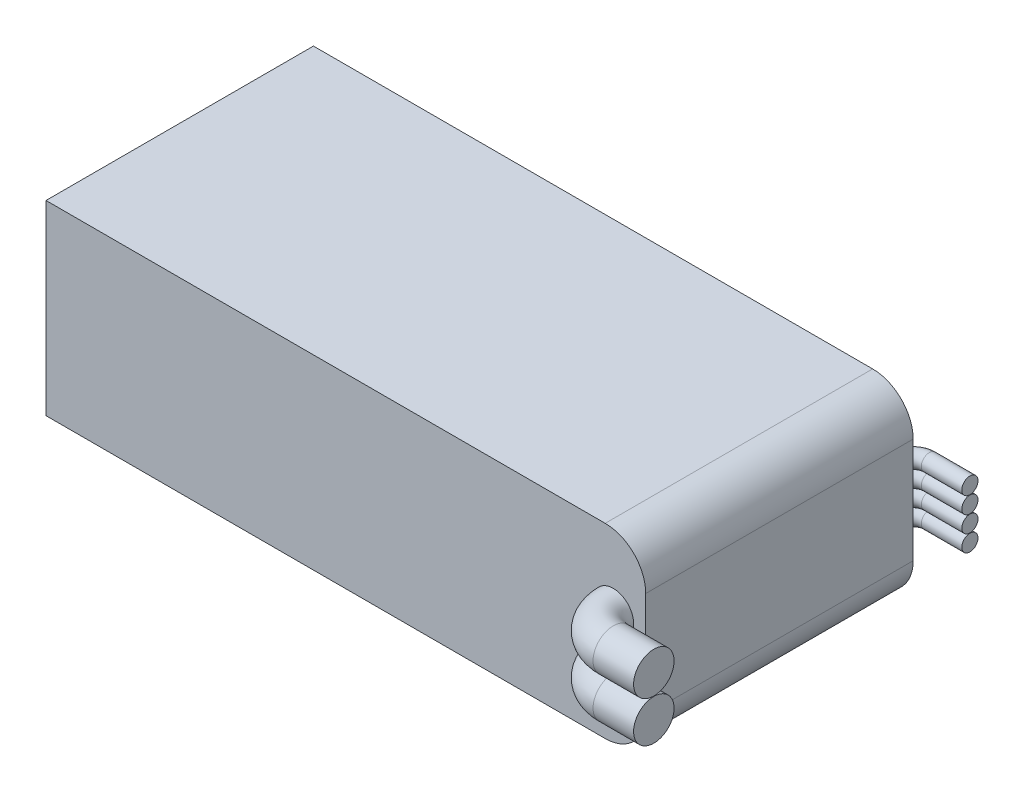
ISO-10303-21;
HEADER;
FILE_DESCRIPTION(('STEP AP214'),'2;1');
FILE_NAME('part.step','',(''),(''),'','','');
FILE_SCHEMA(('AUTOMOTIVE_DESIGN { 1 0 10303 214 1 1 1 1 }'));
ENDSEC;
DATA;
#1=APPLICATION_CONTEXT('core data for automotive mechanical design processes');
#2=APPLICATION_PROTOCOL_DEFINITION('international standard','automotive_design',2000,#1);
#3=PRODUCT_CONTEXT('',#1,'mechanical');
#4=PRODUCT('Part','Part','',(#3));
#5=PRODUCT_RELATED_PRODUCT_CATEGORY('part','',(#4));
#6=PRODUCT_DEFINITION_FORMATION('','',#4);
#7=PRODUCT_DEFINITION_CONTEXT('part definition',#1,'design');
#8=PRODUCT_DEFINITION('design','',#6,#7);
#9=PRODUCT_DEFINITION_SHAPE('','',#8);
#10=(LENGTH_UNIT() NAMED_UNIT(*) SI_UNIT(.MILLI.,.METRE.));
#11=(NAMED_UNIT(*) PLANE_ANGLE_UNIT() SI_UNIT($,.RADIAN.));
#12=(NAMED_UNIT(*) SI_UNIT($,.STERADIAN.) SOLID_ANGLE_UNIT());
#13=UNCERTAINTY_MEASURE_WITH_UNIT(LENGTH_MEASURE(1.E-05),#10,'distance_accuracy_value','');
#14=(GEOMETRIC_REPRESENTATION_CONTEXT(3) GLOBAL_UNCERTAINTY_ASSIGNED_CONTEXT((#13)) GLOBAL_UNIT_ASSIGNED_CONTEXT((#10,
#11,#12)) REPRESENTATION_CONTEXT('',''));
#15=CARTESIAN_POINT('',(0.,0.,0.));
#16=DIRECTION('',(0.,0.,1.));
#17=DIRECTION('',(1.,0.,0.));
#18=AXIS2_PLACEMENT_3D('',#15,#16,#17);
#19=CARTESIAN_POINT('',(37.,23.,16.5));
#20=DIRECTION('',(-1.,0.,0.));
#21=DIRECTION('',(0.,0.,1.));
#22=AXIS2_PLACEMENT_3D('',#19,#20,#21);
#23=PLANE('',#22);
#24=DIRECTION('',(0.,-1.,0.));
#25=VECTOR('',#24,1.);
#26=CARTESIAN_POINT('',(37.,23.,16.5));
#27=LINE('',#26,#25);
#28=CARTESIAN_POINT('',(37.,18.,16.5));
#29=VERTEX_POINT('',#28);
#30=CARTESIAN_POINT('',(37.,5.,16.5));
#31=VERTEX_POINT('',#30);
#32=EDGE_CURVE('E129',#29,#31,#27,.T.);
#33=ORIENTED_EDGE('',*,*,#32,.T.);
#34=DIRECTION('',(0.,0.,-1.));
#35=VECTOR('',#34,1.);
#36=CARTESIAN_POINT('',(37.,5.,-16.5));
#37=LINE('',#36,#35);
#38=CARTESIAN_POINT('',(37.,5.,-16.5));
#39=VERTEX_POINT('',#38);
#40=EDGE_CURVE('E151',#31,#39,#37,.T.);
#41=ORIENTED_EDGE('',*,*,#40,.T.);
#42=DIRECTION('',(0.,-1.,0.));
#43=VECTOR('',#42,1.);
#44=CARTESIAN_POINT('',(37.,23.,-16.5));
#45=LINE('',#44,#43);
#46=CARTESIAN_POINT('',(37.,18.,-16.5));
#47=VERTEX_POINT('',#46);
#48=EDGE_CURVE('E120',#47,#39,#45,.T.);
#49=ORIENTED_EDGE('',*,*,#48,.F.);
#50=DIRECTION('',(0.,0.,-1.));
#51=VECTOR('',#50,1.);
#52=CARTESIAN_POINT('',(37.,18.,16.5));
#53=LINE('',#52,#51);
#54=EDGE_CURVE('E148',#47,#29,#53,.F.);
#55=ORIENTED_EDGE('',*,*,#54,.T.);
#56=EDGE_LOOP('',(#33,#41,#49,#55));
#57=FACE_BOUND('',#56,.T.);
#58=ADVANCED_FACE('F41',(#57),#23,.F.);
#59=CARTESIAN_POINT('',(-37.,23.,-16.5));
#60=DIRECTION('',(0.,0.,1.));
#61=DIRECTION('',(1.,0.,0.));
#62=AXIS2_PLACEMENT_3D('',#59,#60,#61);
#63=PLANE('',#62);
#64=CARTESIAN_POINT('',(35.,8.44,-16.5));
#65=DIRECTION('',(0.,0.,-1.));
#66=DIRECTION('',(-1.,0.,0.));
#67=AXIS2_PLACEMENT_3D('',#64,#65,#66);
#68=CIRCLE('',#67,0.999999999999998);
#69=CARTESIAN_POINT('',(34.,8.44,-16.5));
#70=VERTEX_POINT('',#69);
#71=EDGE_CURVE('E284',#70,#70,#68,.T.);
#72=ORIENTED_EDGE('',*,*,#71,.F.);
#73=EDGE_LOOP('',(#72));
#74=FACE_BOUND('',#73,.T.);
#75=CARTESIAN_POINT('',(35.,14.56,-16.5));
#76=DIRECTION('',(0.,0.,-1.));
#77=DIRECTION('',(-1.,0.,0.));
#78=AXIS2_PLACEMENT_3D('',#75,#76,#77);
#79=CIRCLE('',#78,0.999999999999998);
#80=CARTESIAN_POINT('',(34.,14.56,-16.5));
#81=VERTEX_POINT('',#80);
#82=EDGE_CURVE('E272',#81,#81,#79,.T.);
#83=ORIENTED_EDGE('',*,*,#82,.F.);
#84=EDGE_LOOP('',(#83));
#85=FACE_BOUND('',#84,.T.);
#86=CARTESIAN_POINT('',(35.,10.48,-16.5));
#87=DIRECTION('',(0.,0.,-1.));
#88=DIRECTION('',(-1.,0.,0.));
#89=AXIS2_PLACEMENT_3D('',#86,#87,#88);
#90=CIRCLE('',#89,0.999999999999998);
#91=CARTESIAN_POINT('',(34.,10.48,-16.5));
#92=VERTEX_POINT('',#91);
#93=EDGE_CURVE('E260',#92,#92,#90,.T.);
#94=ORIENTED_EDGE('',*,*,#93,.F.);
#95=EDGE_LOOP('',(#94));
#96=FACE_BOUND('',#95,.T.);
#97=CARTESIAN_POINT('',(35.,12.52,-16.5));
#98=DIRECTION('',(0.,0.,-1.));
#99=DIRECTION('',(-1.,0.,0.));
#100=AXIS2_PLACEMENT_3D('',#97,#98,#99);
#101=CIRCLE('',#100,0.999999999999998);
#102=CARTESIAN_POINT('',(34.,12.52,-16.5));
#103=VERTEX_POINT('',#102);
#104=EDGE_CURVE('E11',#103,#103,#101,.T.);
#105=ORIENTED_EDGE('',*,*,#104,.F.);
#106=EDGE_LOOP('',(#105));
#107=FACE_BOUND('',#106,.T.);
#108=ORIENTED_EDGE('',*,*,#48,.T.);
#109=CARTESIAN_POINT('',(32.,5.,-16.5));
#110=DIRECTION('',(0.,0.,1.));
#111=DIRECTION('',(1.,0.,0.));
#112=AXIS2_PLACEMENT_3D('',#109,#110,#111);
#113=CIRCLE('',#112,5.);
#114=CARTESIAN_POINT('',(32.,0.,-16.5));
#115=VERTEX_POINT('',#114);
#116=EDGE_CURVE('E158',#39,#115,#113,.F.);
#117=ORIENTED_EDGE('',*,*,#116,.T.);
#118=DIRECTION('',(-1.,0.,0.));
#119=VECTOR('',#118,1.);
#120=CARTESIAN_POINT('',(-37.,0.,-16.5));
#121=LINE('',#120,#119);
#122=CARTESIAN_POINT('',(-37.,0.,-16.5));
#123=VERTEX_POINT('',#122);
#124=EDGE_CURVE('E116',#115,#123,#121,.T.);
#125=ORIENTED_EDGE('',*,*,#124,.T.);
#126=DIRECTION('',(0.,-1.,0.));
#127=VECTOR('',#126,1.);
#128=CARTESIAN_POINT('',(-37.,23.,-16.5));
#129=LINE('',#128,#127);
#130=CARTESIAN_POINT('',(-37.,23.,-16.5));
#131=VERTEX_POINT('',#130);
#132=EDGE_CURVE('E113',#131,#123,#129,.T.);
#133=ORIENTED_EDGE('',*,*,#132,.F.);
#134=DIRECTION('',(-1.,0.,0.));
#135=VECTOR('',#134,1.);
#136=CARTESIAN_POINT('',(-37.,23.,-16.5));
#137=LINE('',#136,#135);
#138=CARTESIAN_POINT('',(32.,23.,-16.5));
#139=VERTEX_POINT('',#138);
#140=EDGE_CURVE('E101',#139,#131,#137,.T.);
#141=ORIENTED_EDGE('',*,*,#140,.F.);
#142=CARTESIAN_POINT('',(32.,18.,-16.5));
#143=DIRECTION('',(0.,0.,1.));
#144=DIRECTION('',(1.,0.,0.));
#145=AXIS2_PLACEMENT_3D('',#142,#143,#144);
#146=CIRCLE('',#145,5.);
#147=EDGE_CURVE('E155',#139,#47,#146,.F.);
#148=ORIENTED_EDGE('',*,*,#147,.T.);
#149=EDGE_LOOP('',(#108,#117,#125,#133,#141,#148));
#150=FACE_BOUND('',#149,.T.);
#151=ADVANCED_FACE('F115',(#74,#85,#96,#107,#150),#63,.F.);
#152=CARTESIAN_POINT('',(-37.,23.,16.5));
#153=DIRECTION('',(1.,0.,0.));
#154=DIRECTION('',(0.,0.,-1.));
#155=AXIS2_PLACEMENT_3D('',#152,#153,#154);
#156=PLANE('',#155);
#157=DIRECTION('',(0.,0.,1.));
#158=VECTOR('',#157,1.);
#159=CARTESIAN_POINT('',(-37.,0.,16.5));
#160=LINE('',#159,#158);
#161=CARTESIAN_POINT('',(-37.,0.,16.5));
#162=VERTEX_POINT('',#161);
#163=EDGE_CURVE('E135',#123,#162,#160,.T.);
#164=ORIENTED_EDGE('',*,*,#163,.T.);
#165=DIRECTION('',(0.,-1.,0.));
#166=VECTOR('',#165,1.);
#167=CARTESIAN_POINT('',(-37.,23.,16.5));
#168=LINE('',#167,#166);
#169=CARTESIAN_POINT('',(-37.,23.,16.5));
#170=VERTEX_POINT('',#169);
#171=EDGE_CURVE('E121',#170,#162,#168,.T.);
#172=ORIENTED_EDGE('',*,*,#171,.F.);
#173=DIRECTION('',(0.,0.,1.));
#174=VECTOR('',#173,1.);
#175=CARTESIAN_POINT('',(-37.,23.,16.5));
#176=LINE('',#175,#174);
#177=EDGE_CURVE('E105',#131,#170,#176,.T.);
#178=ORIENTED_EDGE('',*,*,#177,.F.);
#179=ORIENTED_EDGE('',*,*,#132,.T.);
#180=EDGE_LOOP('',(#164,#172,#178,#179));
#181=FACE_BOUND('',#180,.T.);
#182=ADVANCED_FACE('F123',(#181),#156,.F.);
#183=CARTESIAN_POINT('',(-37.,23.,16.5));
#184=DIRECTION('',(0.,0.,-1.));
#185=DIRECTION('',(-1.,0.,0.));
#186=AXIS2_PLACEMENT_3D('',#183,#184,#185);
#187=PLANE('',#186);
#188=CARTESIAN_POINT('',(33.,9.,16.5));
#189=DIRECTION('',(0.,0.,1.));
#190=DIRECTION('',(1.,0.,0.));
#191=AXIS2_PLACEMENT_3D('',#188,#189,#190);
#192=CIRCLE('',#191,2.5);
#193=CARTESIAN_POINT('',(30.5,9.,16.5));
#194=VERTEX_POINT('',#193);
#195=EDGE_CURVE('E236',#194,#194,#192,.T.);
#196=ORIENTED_EDGE('',*,*,#195,.F.);
#197=EDGE_LOOP('',(#196));
#198=FACE_BOUND('',#197,.T.);
#199=CARTESIAN_POINT('',(33.,14.05,16.5));
#200=DIRECTION('',(0.,0.,1.));
#201=DIRECTION('',(1.,0.,0.));
#202=AXIS2_PLACEMENT_3D('',#199,#200,#201);
#203=CIRCLE('',#202,2.5);
#204=CARTESIAN_POINT('',(30.5,14.05,16.5));
#205=VERTEX_POINT('',#204);
#206=EDGE_CURVE('E51',#205,#205,#203,.T.);
#207=ORIENTED_EDGE('',*,*,#206,.F.);
#208=EDGE_LOOP('',(#207));
#209=FACE_BOUND('',#208,.T.);
#210=DIRECTION('',(1.,0.,0.));
#211=VECTOR('',#210,1.);
#212=CARTESIAN_POINT('',(-37.,0.,16.5));
#213=LINE('',#212,#211);
#214=CARTESIAN_POINT('',(32.,0.,16.5));
#215=VERTEX_POINT('',#214);
#216=EDGE_CURVE('E110',#162,#215,#213,.T.);
#217=ORIENTED_EDGE('',*,*,#216,.T.);
#218=CARTESIAN_POINT('',(32.,5.,16.5));
#219=DIRECTION('',(0.,0.,-1.));
#220=DIRECTION('',(-1.,0.,0.));
#221=AXIS2_PLACEMENT_3D('',#218,#219,#220);
#222=CIRCLE('',#221,5.);
#223=EDGE_CURVE('E164',#215,#31,#222,.F.);
#224=ORIENTED_EDGE('',*,*,#223,.T.);
#225=ORIENTED_EDGE('',*,*,#32,.F.);
#226=CARTESIAN_POINT('',(32.,18.,16.5));
#227=DIRECTION('',(0.,0.,-1.));
#228=DIRECTION('',(-1.,0.,0.));
#229=AXIS2_PLACEMENT_3D('',#226,#227,#228);
#230=CIRCLE('',#229,5.);
#231=CARTESIAN_POINT('',(32.,23.,16.5));
#232=VERTEX_POINT('',#231);
#233=EDGE_CURVE('E59',#29,#232,#230,.F.);
#234=ORIENTED_EDGE('',*,*,#233,.T.);
#235=DIRECTION('',(1.,0.,0.));
#236=VECTOR('',#235,1.);
#237=CARTESIAN_POINT('',(-37.,23.,16.5));
#238=LINE('',#237,#236);
#239=EDGE_CURVE('E126',#170,#232,#238,.T.);
#240=ORIENTED_EDGE('',*,*,#239,.F.);
#241=ORIENTED_EDGE('',*,*,#171,.T.);
#242=EDGE_LOOP('',(#217,#224,#225,#234,#240,#241));
#243=FACE_BOUND('',#242,.T.);
#244=ADVANCED_FACE('F224',(#198,#209,#243),#187,.F.);
#245=CARTESIAN_POINT('',(0.,23.,0.));
#246=DIRECTION('',(0.,-1.,0.));
#247=DIRECTION('',(0.,0.,-1.));
#248=AXIS2_PLACEMENT_3D('',#245,#246,#247);
#249=PLANE('',#248);
#250=ORIENTED_EDGE('',*,*,#239,.T.);
#251=DIRECTION('',(0.,0.,-1.));
#252=VECTOR('',#251,1.);
#253=CARTESIAN_POINT('',(32.,23.,0.));
#254=LINE('',#253,#252);
#255=EDGE_CURVE('E45',#232,#139,#254,.T.);
#256=ORIENTED_EDGE('',*,*,#255,.T.);
#257=ORIENTED_EDGE('',*,*,#140,.T.);
#258=ORIENTED_EDGE('',*,*,#177,.T.);
#259=EDGE_LOOP('',(#250,#256,#257,#258));
#260=FACE_BOUND('',#259,.T.);
#261=ADVANCED_FACE('F103',(#260),#249,.F.);
#262=CARTESIAN_POINT('',(0.,0.,0.));
#263=DIRECTION('',(0.,-1.,0.));
#264=DIRECTION('',(0.,0.,-1.));
#265=AXIS2_PLACEMENT_3D('',#262,#263,#264);
#266=PLANE('',#265);
#267=ORIENTED_EDGE('',*,*,#124,.F.);
#268=DIRECTION('',(0.,0.,-1.));
#269=VECTOR('',#268,1.);
#270=CARTESIAN_POINT('',(32.,0.,16.5));
#271=LINE('',#270,#269);
#272=EDGE_CURVE('E67',#115,#215,#271,.F.);
#273=ORIENTED_EDGE('',*,*,#272,.T.);
#274=ORIENTED_EDGE('',*,*,#216,.F.);
#275=ORIENTED_EDGE('',*,*,#163,.F.);
#276=EDGE_LOOP('',(#267,#273,#274,#275));
#277=FACE_BOUND('',#276,.T.);
#278=ADVANCED_FACE('F213',(#277),#266,.T.);
#279=CARTESIAN_POINT('',(32.,5.,16.5));
#280=DIRECTION('',(0.,0.,1.));
#281=DIRECTION('',(1.,0.,0.));
#282=AXIS2_PLACEMENT_3D('',#279,#280,#281);
#283=CYLINDRICAL_SURFACE('',#282,5.);
#284=ORIENTED_EDGE('',*,*,#223,.F.);
#285=ORIENTED_EDGE('',*,*,#272,.F.);
#286=ORIENTED_EDGE('',*,*,#116,.F.);
#287=ORIENTED_EDGE('',*,*,#40,.F.);
#288=EDGE_LOOP('',(#284,#285,#286,#287));
#289=FACE_BOUND('',#288,.T.);
#290=ADVANCED_FACE('F211',(#289),#283,.T.);
#291=CARTESIAN_POINT('',(32.,18.,0.));
#292=DIRECTION('',(0.,0.,-1.));
#293=DIRECTION('',(-1.,0.,0.));
#294=AXIS2_PLACEMENT_3D('',#291,#292,#293);
#295=CYLINDRICAL_SURFACE('',#294,5.);
#296=ORIENTED_EDGE('',*,*,#233,.F.);
#297=ORIENTED_EDGE('',*,*,#54,.F.);
#298=ORIENTED_EDGE('',*,*,#147,.F.);
#299=ORIENTED_EDGE('',*,*,#255,.F.);
#300=EDGE_LOOP('',(#296,#297,#298,#299));
#301=FACE_BOUND('',#300,.T.);
#302=ADVANCED_FACE('F43',(#301),#295,.T.);
#303=CARTESIAN_POINT('',(42.,14.05,20.5));
#304=DIRECTION('',(1.,0.,0.));
#305=DIRECTION('',(0.,0.,-1.));
#306=AXIS2_PLACEMENT_3D('',#303,#304,#305);
#307=PLANE('',#306);
#308=CARTESIAN_POINT('',(42.,14.05,20.5));
#309=DIRECTION('',(1.,0.,0.));
#310=DIRECTION('',(0.,0.,-1.));
#311=AXIS2_PLACEMENT_3D('',#308,#309,#310);
#312=CIRCLE('',#311,2.5);
#313=CARTESIAN_POINT('',(42.,14.05,18.));
#314=VERTEX_POINT('',#313);
#315=EDGE_CURVE('E136',#314,#314,#312,.T.);
#316=ORIENTED_EDGE('',*,*,#315,.T.);
#317=EDGE_LOOP('',(#316));
#318=FACE_BOUND('',#317,.T.);
#319=ADVANCED_FACE('F184',(#318),#307,.T.);
#320=CARTESIAN_POINT('',(37.,14.05,16.5));
#321=DIRECTION('',(0.,1.,0.));
#322=DIRECTION('',(0.,0.,1.));
#323=AXIS2_PLACEMENT_3D('',#320,#321,#322);
#324=TOROIDAL_SURFACE('',#323,3.99999999999999,2.5);
#325=CARTESIAN_POINT('',(37.,14.05,20.5));
#326=DIRECTION('',(1.,0.,0.));
#327=DIRECTION('',(0.,0.,-1.));
#328=AXIS2_PLACEMENT_3D('',#325,#326,#327);
#329=CIRCLE('',#328,2.5);
#330=CARTESIAN_POINT('',(37.,14.05,23.));
#331=VERTEX_POINT('',#330);
#332=EDGE_CURVE('E177',#331,#331,#329,.T.);
#333=CARTESIAN_POINT('',(37.,14.05,16.5));
#334=DIRECTION('',(0.,1.,0.));
#335=DIRECTION('',(0.,0.,1.));
#336=AXIS2_PLACEMENT_3D('',#333,#334,#335);
#337=CIRCLE('',#336,6.49999999999999);
#338=EDGE_CURVE('',#205,#331,#337,.T.);
#339=ORIENTED_EDGE('',*,*,#206,.T.);
#340=ORIENTED_EDGE('',*,*,#332,.F.);
#341=ORIENTED_EDGE('',*,*,#338,.T.);
#342=ORIENTED_EDGE('',*,*,#338,.F.);
#343=EDGE_LOOP('',(#339,#341,#340,#342));
#344=FACE_BOUND('',#343,.T.);
#345=ADVANCED_FACE('F190',(#344),#324,.T.);
#346=CARTESIAN_POINT('',(37.,14.05,20.5));
#347=DIRECTION('',(1.,0.,0.));
#348=DIRECTION('',(0.,0.,-1.));
#349=AXIS2_PLACEMENT_3D('',#346,#347,#348);
#350=CYLINDRICAL_SURFACE('',#349,2.5);
#351=ORIENTED_EDGE('',*,*,#315,.F.);
#352=EDGE_LOOP('',(#351));
#353=FACE_BOUND('',#352,.T.);
#354=ORIENTED_EDGE('',*,*,#332,.T.);
#355=EDGE_LOOP('',(#354));
#356=FACE_BOUND('',#355,.T.);
#357=ADVANCED_FACE('F186',(#353,#356),#350,.T.);
#358=CARTESIAN_POINT('',(42.,9.,20.5));
#359=DIRECTION('',(1.,0.,0.));
#360=DIRECTION('',(0.,0.,-1.));
#361=AXIS2_PLACEMENT_3D('',#358,#359,#360);
#362=PLANE('',#361);
#363=CARTESIAN_POINT('',(42.,9.,20.5));
#364=DIRECTION('',(1.,0.,0.));
#365=DIRECTION('',(0.,0.,-1.));
#366=AXIS2_PLACEMENT_3D('',#363,#364,#365);
#367=CIRCLE('',#366,2.5);
#368=CARTESIAN_POINT('',(42.,9.,18.));
#369=VERTEX_POINT('',#368);
#370=EDGE_CURVE('E175',#369,#369,#367,.T.);
#371=ORIENTED_EDGE('',*,*,#370,.T.);
#372=EDGE_LOOP('',(#371));
#373=FACE_BOUND('',#372,.T.);
#374=ADVANCED_FACE('F189',(#373),#362,.T.);
#375=CARTESIAN_POINT('',(37.,9.,16.5));
#376=DIRECTION('',(0.,1.,0.));
#377=DIRECTION('',(0.,0.,1.));
#378=AXIS2_PLACEMENT_3D('',#375,#376,#377);
#379=TOROIDAL_SURFACE('',#378,4.,2.5);
#380=CARTESIAN_POINT('',(37.,9.,20.5));
#381=DIRECTION('',(1.,0.,0.));
#382=DIRECTION('',(0.,0.,-1.));
#383=AXIS2_PLACEMENT_3D('',#380,#381,#382);
#384=CIRCLE('',#383,2.5);
#385=CARTESIAN_POINT('',(37.,9.,23.));
#386=VERTEX_POINT('',#385);
#387=EDGE_CURVE('E239',#386,#386,#384,.T.);
#388=CARTESIAN_POINT('',(37.,9.,16.5));
#389=DIRECTION('',(0.,1.,0.));
#390=DIRECTION('',(0.,0.,1.));
#391=AXIS2_PLACEMENT_3D('',#388,#389,#390);
#392=CIRCLE('',#391,6.5);
#393=EDGE_CURVE('',#194,#386,#392,.T.);
#394=ORIENTED_EDGE('',*,*,#195,.T.);
#395=ORIENTED_EDGE('',*,*,#387,.F.);
#396=ORIENTED_EDGE('',*,*,#393,.T.);
#397=ORIENTED_EDGE('',*,*,#393,.F.);
#398=EDGE_LOOP('',(#394,#396,#395,#397));
#399=FACE_BOUND('',#398,.T.);
#400=ADVANCED_FACE('F317',(#399),#379,.T.);
#401=CARTESIAN_POINT('',(37.,9.,20.5));
#402=DIRECTION('',(1.,0.,0.));
#403=DIRECTION('',(0.,0.,-1.));
#404=AXIS2_PLACEMENT_3D('',#401,#402,#403);
#405=CYLINDRICAL_SURFACE('',#404,2.5);
#406=ORIENTED_EDGE('',*,*,#370,.F.);
#407=EDGE_LOOP('',(#406));
#408=FACE_BOUND('',#407,.T.);
#409=ORIENTED_EDGE('',*,*,#387,.T.);
#410=EDGE_LOOP('',(#409));
#411=FACE_BOUND('',#410,.T.);
#412=ADVANCED_FACE('F200',(#408,#411),#405,.T.);
#413=CARTESIAN_POINT('',(42.,12.52,-18.5));
#414=DIRECTION('',(1.,0.,0.));
#415=DIRECTION('',(0.,0.,-1.));
#416=AXIS2_PLACEMENT_3D('',#413,#414,#415);
#417=PLANE('',#416);
#418=CARTESIAN_POINT('',(42.,12.52,-18.5));
#419=DIRECTION('',(1.,0.,0.));
#420=DIRECTION('',(0.,0.,-1.));
#421=AXIS2_PLACEMENT_3D('',#418,#419,#420);
#422=CIRCLE('',#421,0.999999999999998);
#423=CARTESIAN_POINT('',(42.,12.52,-19.5));
#424=VERTEX_POINT('',#423);
#425=EDGE_CURVE('E240',#424,#424,#422,.T.);
#426=ORIENTED_EDGE('',*,*,#425,.T.);
#427=EDGE_LOOP('',(#426));
#428=FACE_BOUND('',#427,.T.);
#429=ADVANCED_FACE('F300',(#428),#417,.T.);
#430=CARTESIAN_POINT('',(37.,12.52,-16.5));
#431=DIRECTION('',(0.,-1.,0.));
#432=DIRECTION('',(0.,0.,-1.));
#433=AXIS2_PLACEMENT_3D('',#430,#431,#432);
#434=TOROIDAL_SURFACE('',#433,2.,0.999999999999998);
#435=CARTESIAN_POINT('',(37.,12.52,-18.5));
#436=DIRECTION('',(1.,0.,0.));
#437=DIRECTION('',(0.,0.,-1.));
#438=AXIS2_PLACEMENT_3D('',#435,#436,#437);
#439=CIRCLE('',#438,0.999999999999998);
#440=CARTESIAN_POINT('',(37.,12.52,-19.5));
#441=VERTEX_POINT('',#440);
#442=EDGE_CURVE('E246',#441,#441,#439,.T.);
#443=CARTESIAN_POINT('',(37.,12.52,-16.5));
#444=DIRECTION('',(0.,-1.,0.));
#445=DIRECTION('',(0.,0.,-1.));
#446=AXIS2_PLACEMENT_3D('',#443,#444,#445);
#447=CIRCLE('',#446,3.);
#448=EDGE_CURVE('',#103,#441,#447,.T.);
#449=ORIENTED_EDGE('',*,*,#104,.T.);
#450=ORIENTED_EDGE('',*,*,#442,.F.);
#451=ORIENTED_EDGE('',*,*,#448,.T.);
#452=ORIENTED_EDGE('',*,*,#448,.F.);
#453=EDGE_LOOP('',(#449,#451,#450,#452));
#454=FACE_BOUND('',#453,.T.);
#455=ADVANCED_FACE('F297',(#454),#434,.T.);
#456=CARTESIAN_POINT('',(37.,12.52,-18.5));
#457=DIRECTION('',(1.,0.,0.));
#458=DIRECTION('',(0.,0.,-1.));
#459=AXIS2_PLACEMENT_3D('',#456,#457,#458);
#460=CYLINDRICAL_SURFACE('',#459,0.999999999999998);
#461=ORIENTED_EDGE('',*,*,#425,.F.);
#462=EDGE_LOOP('',(#461));
#463=FACE_BOUND('',#462,.T.);
#464=ORIENTED_EDGE('',*,*,#442,.T.);
#465=EDGE_LOOP('',(#464));
#466=FACE_BOUND('',#465,.T.);
#467=ADVANCED_FACE('F299',(#463,#466),#460,.T.);
#468=CARTESIAN_POINT('',(42.,10.48,-18.5));
#469=DIRECTION('',(1.,0.,0.));
#470=DIRECTION('',(0.,0.,-1.));
#471=AXIS2_PLACEMENT_3D('',#468,#469,#470);
#472=PLANE('',#471);
#473=CARTESIAN_POINT('',(42.,10.48,-18.5));
#474=DIRECTION('',(1.,0.,0.));
#475=DIRECTION('',(0.,0.,-1.));
#476=AXIS2_PLACEMENT_3D('',#473,#474,#475);
#477=CIRCLE('',#476,0.999999999999998);
#478=CARTESIAN_POINT('',(42.,10.48,-19.5));
#479=VERTEX_POINT('',#478);
#480=EDGE_CURVE('E251',#479,#479,#477,.T.);
#481=ORIENTED_EDGE('',*,*,#480,.T.);
#482=EDGE_LOOP('',(#481));
#483=FACE_BOUND('',#482,.T.);
#484=ADVANCED_FACE('F307',(#483),#472,.T.);
#485=CARTESIAN_POINT('',(37.,10.48,-16.5));
#486=DIRECTION('',(0.,-1.,0.));
#487=DIRECTION('',(0.,0.,-1.));
#488=AXIS2_PLACEMENT_3D('',#485,#486,#487);
#489=TOROIDAL_SURFACE('',#488,2.,0.999999999999998);
#490=CARTESIAN_POINT('',(37.,10.48,-18.5));
#491=DIRECTION('',(1.,0.,0.));
#492=DIRECTION('',(0.,0.,-1.));
#493=AXIS2_PLACEMENT_3D('',#490,#491,#492);
#494=CIRCLE('',#493,0.999999999999998);
#495=CARTESIAN_POINT('',(37.,10.48,-19.5));
#496=VERTEX_POINT('',#495);
#497=EDGE_CURVE('E256',#496,#496,#494,.T.);
#498=CARTESIAN_POINT('',(37.,10.48,-16.5));
#499=DIRECTION('',(0.,-1.,0.));
#500=DIRECTION('',(0.,0.,-1.));
#501=AXIS2_PLACEMENT_3D('',#498,#499,#500);
#502=CIRCLE('',#501,3.);
#503=EDGE_CURVE('',#92,#496,#502,.T.);
#504=ORIENTED_EDGE('',*,*,#93,.T.);
#505=ORIENTED_EDGE('',*,*,#497,.F.);
#506=ORIENTED_EDGE('',*,*,#503,.T.);
#507=ORIENTED_EDGE('',*,*,#503,.F.);
#508=EDGE_LOOP('',(#504,#506,#505,#507));
#509=FACE_BOUND('',#508,.T.);
#510=ADVANCED_FACE('F430',(#509),#489,.T.);
#511=CARTESIAN_POINT('',(37.,10.48,-18.5));
#512=DIRECTION('',(1.,0.,0.));
#513=DIRECTION('',(0.,0.,-1.));
#514=AXIS2_PLACEMENT_3D('',#511,#512,#513);
#515=CYLINDRICAL_SURFACE('',#514,0.999999999999998);
#516=ORIENTED_EDGE('',*,*,#480,.F.);
#517=EDGE_LOOP('',(#516));
#518=FACE_BOUND('',#517,.T.);
#519=ORIENTED_EDGE('',*,*,#497,.T.);
#520=EDGE_LOOP('',(#519));
#521=FACE_BOUND('',#520,.T.);
#522=ADVANCED_FACE('F312',(#518,#521),#515,.T.);
#523=CARTESIAN_POINT('',(42.,14.56,-18.5));
#524=DIRECTION('',(1.,0.,0.));
#525=DIRECTION('',(0.,0.,-1.));
#526=AXIS2_PLACEMENT_3D('',#523,#524,#525);
#527=PLANE('',#526);
#528=CARTESIAN_POINT('',(42.,14.56,-18.5));
#529=DIRECTION('',(1.,0.,0.));
#530=DIRECTION('',(0.,0.,-1.));
#531=AXIS2_PLACEMENT_3D('',#528,#529,#530);
#532=CIRCLE('',#531,0.999999999999998);
#533=CARTESIAN_POINT('',(42.,14.56,-19.5));
#534=VERTEX_POINT('',#533);
#535=EDGE_CURVE('E264',#534,#534,#532,.T.);
#536=ORIENTED_EDGE('',*,*,#535,.T.);
#537=EDGE_LOOP('',(#536));
#538=FACE_BOUND('',#537,.T.);
#539=ADVANCED_FACE('F356',(#538),#527,.T.);
#540=CARTESIAN_POINT('',(37.,14.56,-16.5));
#541=DIRECTION('',(0.,-1.,0.));
#542=DIRECTION('',(0.,0.,-1.));
#543=AXIS2_PLACEMENT_3D('',#540,#541,#542);
#544=TOROIDAL_SURFACE('',#543,2.,0.999999999999998);
#545=CARTESIAN_POINT('',(37.,14.56,-18.5));
#546=DIRECTION('',(1.,0.,0.));
#547=DIRECTION('',(0.,0.,-1.));
#548=AXIS2_PLACEMENT_3D('',#545,#546,#547);
#549=CIRCLE('',#548,0.999999999999998);
#550=CARTESIAN_POINT('',(37.,14.56,-19.5));
#551=VERTEX_POINT('',#550);
#552=EDGE_CURVE('E268',#551,#551,#549,.T.);
#553=CARTESIAN_POINT('',(37.,14.56,-16.5));
#554=DIRECTION('',(0.,-1.,0.));
#555=DIRECTION('',(0.,0.,-1.));
#556=AXIS2_PLACEMENT_3D('',#553,#554,#555);
#557=CIRCLE('',#556,3.);
#558=EDGE_CURVE('',#81,#551,#557,.T.);
#559=ORIENTED_EDGE('',*,*,#82,.T.);
#560=ORIENTED_EDGE('',*,*,#552,.F.);
#561=ORIENTED_EDGE('',*,*,#558,.T.);
#562=ORIENTED_EDGE('',*,*,#558,.F.);
#563=EDGE_LOOP('',(#559,#561,#560,#562));
#564=FACE_BOUND('',#563,.T.);
#565=ADVANCED_FACE('F361',(#564),#544,.T.);
#566=CARTESIAN_POINT('',(37.,14.56,-18.5));
#567=DIRECTION('',(1.,0.,0.));
#568=DIRECTION('',(0.,0.,-1.));
#569=AXIS2_PLACEMENT_3D('',#566,#567,#568);
#570=CYLINDRICAL_SURFACE('',#569,0.999999999999998);
#571=ORIENTED_EDGE('',*,*,#535,.F.);
#572=EDGE_LOOP('',(#571));
#573=FACE_BOUND('',#572,.T.);
#574=ORIENTED_EDGE('',*,*,#552,.T.);
#575=EDGE_LOOP('',(#574));
#576=FACE_BOUND('',#575,.T.);
#577=ADVANCED_FACE('F374',(#573,#576),#570,.T.);
#578=CARTESIAN_POINT('',(42.,8.44,-18.5));
#579=DIRECTION('',(1.,0.,0.));
#580=DIRECTION('',(0.,0.,-1.));
#581=AXIS2_PLACEMENT_3D('',#578,#579,#580);
#582=PLANE('',#581);
#583=CARTESIAN_POINT('',(42.,8.44,-18.5));
#584=DIRECTION('',(1.,0.,0.));
#585=DIRECTION('',(0.,0.,-1.));
#586=AXIS2_PLACEMENT_3D('',#583,#584,#585);
#587=CIRCLE('',#586,0.999999999999998);
#588=CARTESIAN_POINT('',(42.,8.44,-19.5));
#589=VERTEX_POINT('',#588);
#590=EDGE_CURVE('E276',#589,#589,#587,.T.);
#591=ORIENTED_EDGE('',*,*,#590,.T.);
#592=EDGE_LOOP('',(#591));
#593=FACE_BOUND('',#592,.T.);
#594=ADVANCED_FACE('F382',(#593),#582,.T.);
#595=CARTESIAN_POINT('',(37.,8.44,-16.5));
#596=DIRECTION('',(0.,-1.,0.));
#597=DIRECTION('',(0.,0.,-1.));
#598=AXIS2_PLACEMENT_3D('',#595,#596,#597);
#599=TOROIDAL_SURFACE('',#598,2.,0.999999999999998);
#600=CARTESIAN_POINT('',(37.,8.44,-18.5));
#601=DIRECTION('',(1.,0.,0.));
#602=DIRECTION('',(0.,0.,-1.));
#603=AXIS2_PLACEMENT_3D('',#600,#601,#602);
#604=CIRCLE('',#603,0.999999999999998);
#605=CARTESIAN_POINT('',(37.,8.44,-19.5));
#606=VERTEX_POINT('',#605);
#607=EDGE_CURVE('E280',#606,#606,#604,.T.);
#608=CARTESIAN_POINT('',(37.,8.44,-16.5));
#609=DIRECTION('',(0.,-1.,0.));
#610=DIRECTION('',(0.,0.,-1.));
#611=AXIS2_PLACEMENT_3D('',#608,#609,#610);
#612=CIRCLE('',#611,3.);
#613=EDGE_CURVE('',#70,#606,#612,.T.);
#614=ORIENTED_EDGE('',*,*,#71,.T.);
#615=ORIENTED_EDGE('',*,*,#607,.F.);
#616=ORIENTED_EDGE('',*,*,#613,.T.);
#617=ORIENTED_EDGE('',*,*,#613,.F.);
#618=EDGE_LOOP('',(#614,#616,#615,#617));
#619=FACE_BOUND('',#618,.T.);
#620=ADVANCED_FACE('F289',(#619),#599,.T.);
#621=CARTESIAN_POINT('',(37.,8.44,-18.5));
#622=DIRECTION('',(1.,0.,0.));
#623=DIRECTION('',(0.,0.,-1.));
#624=AXIS2_PLACEMENT_3D('',#621,#622,#623);
#625=CYLINDRICAL_SURFACE('',#624,0.999999999999998);
#626=ORIENTED_EDGE('',*,*,#590,.F.);
#627=EDGE_LOOP('',(#626));
#628=FACE_BOUND('',#627,.T.);
#629=ORIENTED_EDGE('',*,*,#607,.T.);
#630=EDGE_LOOP('',(#629));
#631=FACE_BOUND('',#630,.T.);
#632=ADVANCED_FACE('F364',(#628,#631),#625,.T.);
#633=CLOSED_SHELL('',(#58,#151,#182,#244,#261,#278,#290,#302,#319,#345,#357,#374,#400,#412,#429,
#455,#467,#484,#510,#522,#539,#565,#577,#594,#620,#632));
#634=MANIFOLD_SOLID_BREP('B2',#633);
#635=ADVANCED_BREP_SHAPE_REPRESENTATION('',(#18,#634),#14);
#636=SHAPE_DEFINITION_REPRESENTATION(#9,#635);
ENDSEC;
END-ISO-10303-21;
